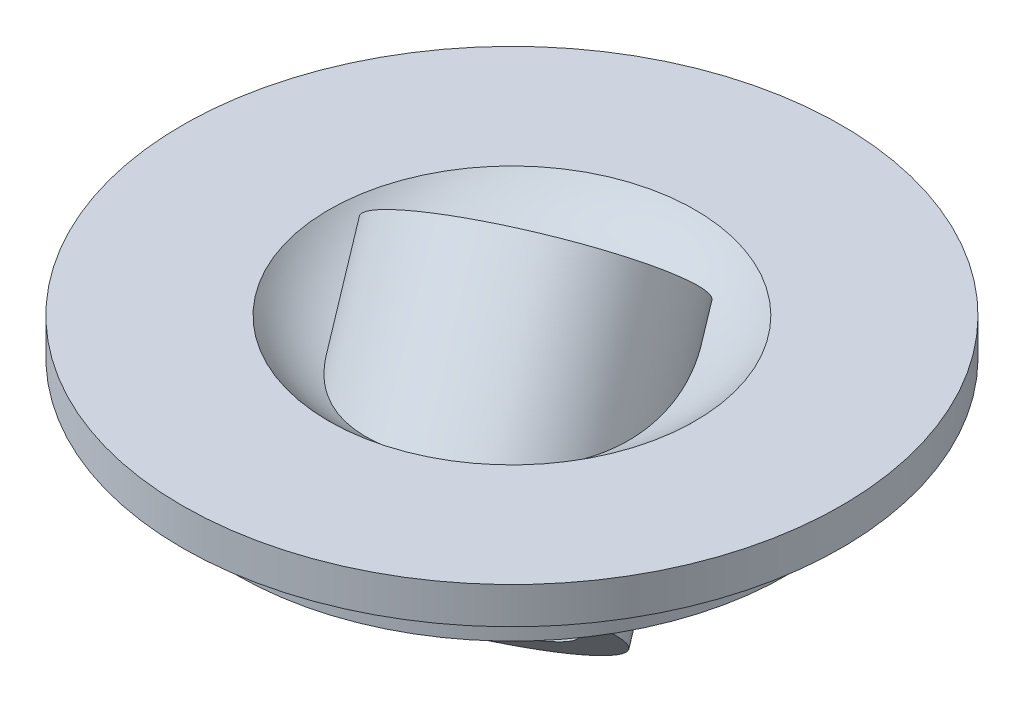
ISO-10303-21;
HEADER;
FILE_DESCRIPTION(('STEP AP214'),'2;1');
FILE_NAME('part.step','',(''),(''),'','','');
FILE_SCHEMA(('AUTOMOTIVE_DESIGN { 1 0 10303 214 1 1 1 1 }'));
ENDSEC;
DATA;
#1=APPLICATION_CONTEXT('core data for automotive mechanical design processes');
#2=APPLICATION_PROTOCOL_DEFINITION('international standard','automotive_design',2000,#1);
#3=PRODUCT_CONTEXT('',#1,'mechanical');
#4=PRODUCT('Part','Part','',(#3));
#5=PRODUCT_RELATED_PRODUCT_CATEGORY('part','',(#4));
#6=PRODUCT_DEFINITION_FORMATION('','',#4);
#7=PRODUCT_DEFINITION_CONTEXT('part definition',#1,'design');
#8=PRODUCT_DEFINITION('design','',#6,#7);
#9=PRODUCT_DEFINITION_SHAPE('','',#8);
#10=(LENGTH_UNIT() NAMED_UNIT(*) SI_UNIT(.MILLI.,.METRE.));
#11=(NAMED_UNIT(*) PLANE_ANGLE_UNIT() SI_UNIT($,.RADIAN.));
#12=(NAMED_UNIT(*) SI_UNIT($,.STERADIAN.) SOLID_ANGLE_UNIT());
#13=UNCERTAINTY_MEASURE_WITH_UNIT(LENGTH_MEASURE(1.E-05),#10,'distance_accuracy_value','');
#14=(GEOMETRIC_REPRESENTATION_CONTEXT(3) GLOBAL_UNCERTAINTY_ASSIGNED_CONTEXT((#13)) GLOBAL_UNIT_ASSIGNED_CONTEXT((#10,
#11,#12)) REPRESENTATION_CONTEXT('',''));
#15=CARTESIAN_POINT('',(0.,0.,0.));
#16=DIRECTION('',(0.,0.,1.));
#17=DIRECTION('',(1.,0.,0.));
#18=AXIS2_PLACEMENT_3D('',#15,#16,#17);
#19=CARTESIAN_POINT('',(-40.5,-20.5132034355964,30.5));
#20=DIRECTION('',(0.,1.,0.));
#21=DIRECTION('',(0.,0.,1.));
#22=AXIS2_PLACEMENT_3D('',#19,#20,#21);
#23=CYLINDRICAL_SURFACE('',#22,7.5);
#24=CARTESIAN_POINT('',(-40.5,0.699999999999999,30.5));
#25=DIRECTION('',(0.,1.,0.));
#26=DIRECTION('',(0.,0.,1.));
#27=AXIS2_PLACEMENT_3D('',#24,#25,#26);
#28=CIRCLE('',#27,7.5);
#29=CARTESIAN_POINT('',(-40.5,0.699999999999999,38.));
#30=VERTEX_POINT('',#29);
#31=EDGE_CURVE('E110',#30,#30,#28,.F.);
#32=ORIENTED_EDGE('',*,*,#31,.F.);
#33=EDGE_LOOP('',(#32));
#34=FACE_BOUND('',#33,.T.);
#35=CARTESIAN_POINT('',(-40.5,2.1,30.5));
#36=DIRECTION('',(0.,1.,0.));
#37=DIRECTION('',(0.,0.,1.));
#38=AXIS2_PLACEMENT_3D('',#35,#36,#37);
#39=CIRCLE('',#38,7.5);
#40=CARTESIAN_POINT('',(-40.5,2.1,38.));
#41=VERTEX_POINT('',#40);
#42=EDGE_CURVE('E109',#41,#41,#39,.T.);
#43=ORIENTED_EDGE('',*,*,#42,.F.);
#44=EDGE_LOOP('',(#43));
#45=FACE_BOUND('',#44,.T.);
#46=ADVANCED_FACE('F44',(#34,#45),#23,.T.);
#47=CARTESIAN_POINT('',(0.,0.7,0.));
#48=DIRECTION('',(0.,1.,0.));
#49=DIRECTION('',(1.,0.,0.));
#50=AXIS2_PLACEMENT_3D('',#47,#48,#49);
#51=PLANE('',#50);
#52=DIRECTION('',(-0.898112973405266,0.,0.439764808734341));
#53=VECTOR('',#52,1.);
#54=CARTESIAN_POINT('',(6.70774966718548,0.7,13.6989519825207));
#55=LINE('',#54,#53);
#56=CARTESIAN_POINT('',(-36.4173963108938,0.7,34.8153617597713));
#57=VERTEX_POINT('',#56);
#58=CARTESIAN_POINT('',(-39.5947315858972,0.7,36.3711573900235));
#59=VERTEX_POINT('',#58);
#60=EDGE_CURVE('E11',#57,#59,#55,.T.);
#61=ORIENTED_EDGE('',*,*,#60,.F.);
#62=CARTESIAN_POINT('',(-39.8843292677719,0.7,31.7573581627674));
#63=DIRECTION('',(0.,1.,0.));
#64=DIRECTION('',(0.439764808734341,0.,0.898112973405266));
#65=AXIS2_PLACEMENT_3D('',#62,#63,#64);
#66=ELLIPSE('',#65,4.94974746830581,3.5);
#67=EDGE_CURVE('E63',#59,#57,#66,.F.);
#68=ORIENTED_EDGE('',*,*,#67,.F.);
#69=EDGE_LOOP('',(#61,#68));
#70=FACE_BOUND('',#69,.T.);
#71=ORIENTED_EDGE('',*,*,#31,.T.);
#72=EDGE_LOOP('',(#71));
#73=FACE_BOUND('',#72,.T.);
#74=ADVANCED_FACE('F174',(#70,#73),#51,.F.);
#75=CARTESIAN_POINT('',(-40.5,2.1,30.5));
#76=DIRECTION('',(0.,1.,0.));
#77=DIRECTION('',(0.,0.,1.));
#78=AXIS2_PLACEMENT_3D('',#75,#76,#77);
#79=PLANE('',#78);
#80=CARTESIAN_POINT('',(-40.5,2.1,30.5));
#81=DIRECTION('',(0.,1.,0.));
#82=DIRECTION('',(0.,0.,1.));
#83=AXIS2_PLACEMENT_3D('',#80,#81,#82);
#84=CIRCLE('',#83,9.);
#85=CARTESIAN_POINT('',(-40.5,2.1,39.5));
#86=VERTEX_POINT('',#85);
#87=EDGE_CURVE('E117',#86,#86,#84,.T.);
#88=ORIENTED_EDGE('',*,*,#87,.F.);
#89=EDGE_LOOP('',(#88));
#90=FACE_BOUND('',#89,.T.);
#91=ORIENTED_EDGE('',*,*,#42,.T.);
#92=EDGE_LOOP('',(#91));
#93=FACE_BOUND('',#92,.T.);
#94=ADVANCED_FACE('F169',(#90,#93),#79,.F.);
#95=CARTESIAN_POINT('',(-40.5,3.1,30.5));
#96=DIRECTION('',(0.,1.,0.));
#97=DIRECTION('',(0.,0.,1.));
#98=AXIS2_PLACEMENT_3D('',#95,#96,#97);
#99=PLANE('',#98);
#100=CARTESIAN_POINT('',(-40.5,3.1,30.5));
#101=DIRECTION('',(0.,1.,0.));
#102=DIRECTION('',(0.,0.,1.));
#103=AXIS2_PLACEMENT_3D('',#100,#101,#102);
#104=CIRCLE('',#103,9.);
#105=CARTESIAN_POINT('',(-40.5,3.1,39.5));
#106=VERTEX_POINT('',#105);
#107=EDGE_CURVE('E113',#106,#106,#104,.T.);
#108=ORIENTED_EDGE('',*,*,#107,.T.);
#109=EDGE_LOOP('',(#108));
#110=FACE_BOUND('',#109,.T.);
#111=CARTESIAN_POINT('',(-40.5,3.1,30.5));
#112=DIRECTION('',(0.,1.,0.));
#113=DIRECTION('',(0.,0.,1.));
#114=AXIS2_PLACEMENT_3D('',#111,#112,#113);
#115=CIRCLE('',#114,5.);
#116=CARTESIAN_POINT('',(-40.5,3.1,35.5));
#117=VERTEX_POINT('',#116);
#118=EDGE_CURVE('E125',#117,#117,#115,.T.);
#119=ORIENTED_EDGE('',*,*,#118,.F.);
#120=EDGE_LOOP('',(#119));
#121=FACE_BOUND('',#120,.T.);
#122=ADVANCED_FACE('F159',(#110,#121),#99,.T.);
#123=CARTESIAN_POINT('',(-40.5,3.1,30.5));
#124=DIRECTION('',(0.,-1.,0.));
#125=DIRECTION('',(0.,0.,-1.));
#126=AXIS2_PLACEMENT_3D('',#123,#124,#125);
#127=CYLINDRICAL_SURFACE('',#126,9.);
#128=ORIENTED_EDGE('',*,*,#107,.F.);
#129=EDGE_LOOP('',(#128));
#130=FACE_BOUND('',#129,.T.);
#131=ORIENTED_EDGE('',*,*,#87,.T.);
#132=EDGE_LOOP('',(#131));
#133=FACE_BOUND('',#132,.T.);
#134=ADVANCED_FACE('F170',(#130,#133),#127,.T.);
#135=CARTESIAN_POINT('',(-40.5,5.1,30.5));
#136=DIRECTION('',(0.,-1.,0.));
#137=DIRECTION('',(0.,0.,-1.));
#138=AXIS2_PLACEMENT_3D('',#135,#136,#137);
#139=DEGENERATE_TOROIDAL_SURFACE('',#138,2.76393202250021,3.,.T.);
#140=ORIENTED_EDGE('',*,*,#118,.T.);
#141=EDGE_LOOP('',(#140));
#142=FACE_BOUND('',#141,.T.);
#143=CARTESIAN_POINT('',(-44.448601078953,2.38896345881085,29.605894368014));
#144=CARTESIAN_POINT('',(-44.396920791439,2.36994167752372,29.5594091770889));
#145=CARTESIAN_POINT('',(-44.3442015196923,2.35202594618844,29.5136467696762));
#146=CARTESIAN_POINT('',(-44.2368609787963,2.31836198322705,29.423604026956));
#147=CARTESIAN_POINT('',(-44.1822401486575,2.30261325541121,29.3793233541316));
#148=CARTESIAN_POINT('',(-44.0161064481141,2.25863201350778,29.2490045630518));
#149=CARTESIAN_POINT('',(-43.9019910177907,2.23354392684724,29.1651932394441));
#150=CARTESIAN_POINT('',(-43.667484927092,2.19097157925665,29.0029643461666));
#151=CARTESIAN_POINT('',(-43.5470559831892,2.17354168698973,28.9245885673583));
#152=CARTESIAN_POINT('',(-43.3020092879931,2.14543622367191,28.7733065122216));
#153=CARTESIAN_POINT('',(-43.1773895344203,2.13476393096336,28.7004029057246));
#154=CARTESIAN_POINT('',(-42.9136887349403,2.11793216964611,28.5525394443383));
#155=CARTESIAN_POINT('',(-42.7743366155507,2.11228169223805,28.4780135912216));
#156=CARTESIAN_POINT('',(-42.4937544911485,2.10483737500911,28.3323365267818));
#157=CARTESIAN_POINT('',(-42.3525237498455,2.10304509499937,28.261186691696));
#158=CARTESIAN_POINT('',(-42.0690292560724,2.10099497539635,28.1200897192807));
#159=CARTESIAN_POINT('',(-41.9267638142986,2.10074093404986,28.050145983918));
#160=CARTESIAN_POINT('',(-41.6420772086585,2.10063203063188,27.9106267276473));
#161=CARTESIAN_POINT('',(-41.4996560690071,2.10077711344583,27.8410511572292));
#162=CARTESIAN_POINT('',(-41.2144911423392,2.10226228275012,27.7030726024159));
#163=CARTESIAN_POINT('',(-41.0717480893089,2.10360069076146,27.6346681085249));
#164=CARTESIAN_POINT('',(-40.7848398124946,2.10966492367458,27.5009344534937));
#165=CARTESIAN_POINT('',(-40.6406744226908,2.11439114873945,27.4356056566211));
#166=CARTESIAN_POINT('',(-40.3508400963931,2.12967343678543,27.3107030526673));
#167=CARTESIAN_POINT('',(-40.2051800969289,2.14020476039637,27.251106075696));
#168=CARTESIAN_POINT('',(-39.911735610813,2.16911966305921,27.1396149174418));
#169=CARTESIAN_POINT('',(-39.76395249237,2.18749838660812,27.0877159997693));
#170=CARTESIAN_POINT('',(-39.4915189671237,2.22971060023012,27.0013187804902));
#171=CARTESIAN_POINT('',(-39.367114533458,2.25212606630535,26.9653620279905));
#172=CARTESIAN_POINT('',(-39.1176314958079,2.30397667337523,26.9009344392815));
#173=CARTESIAN_POINT('',(-38.9925522474228,2.33342047885088,26.8724729349675));
#174=CARTESIAN_POINT('',(-38.7435520766674,2.39938458342999,26.8239963967399));
#175=CARTESIAN_POINT('',(-38.6196290518684,2.43585553196174,26.8039253841829));
#176=CARTESIAN_POINT('',(-38.3731252371842,2.51605896627242,26.7725259172548));
#177=CARTESIAN_POINT('',(-38.2505432874539,2.55978454343618,26.7611892025928));
#178=CARTESIAN_POINT('',(-38.0729843934856,2.62896601825304,26.7512765540822));
#179=CARTESIAN_POINT('',(-38.0170822378407,2.65161026681834,26.7491169680645));
#180=CARTESIAN_POINT('',(-37.9057513575378,2.69846302862971,26.7467713372434));
#181=CARTESIAN_POINT('',(-37.8503239392276,2.72267486191056,26.7465896287771));
#182=CARTESIAN_POINT('',(-37.79524163458,2.74763769724285,26.7474131066537));
#183=B_SPLINE_CURVE_WITH_KNOTS('',3,(#143,#144,#145,#146,#147,#148,#149,#150,#151,#152,#153,
#154,#155,#156,#157,#158,#159,#160,#161,#162,#163,#164,#165,#166,#167,#168,#169,#170,#171,#172,
#173,#174,#175,#176,#177,#178,#179,#180,#181,#182),.UNSPECIFIED.,.F.,.F.,(4,2,2,2,2,2,2,2,2,2,2,
2,2,2,2,2,2,2,2,4),(0.,0.216156357494177,0.432263137919807,0.863099684150951,1.29694735076109,
1.73100533075689,2.20522974247453,2.679645840004,3.15523289822364,3.63075428653179,
4.10560788057352,4.58051757274534,5.05341883463436,5.52602791647742,5.91993510061711,
6.31433042140597,6.70605076802737,7.09740019652323,7.27841280039937,7.45982218008999),.UNSPECIFIED.);
#184=CARTESIAN_POINT('',(-44.413778725801,2.37636991684562,29.5748212310421));
#185=VERTEX_POINT('',#184);
#186=CARTESIAN_POINT('',(-43.1295718501551,2.13206798505995,28.6739869854774));
#187=VERTEX_POINT('',#186);
#188=EDGE_CURVE('E54',#185,#187,#183,.T.);
#189=ORIENTED_EDGE('',*,*,#188,.T.);
#190=CARTESIAN_POINT('',(-42.1294946723215,2.24271637961015,27.2024128686993));
#191=CARTESIAN_POINT('',(-42.0450748092779,2.24288878104044,27.1600953738742));
#192=CARTESIAN_POINT('',(-41.9563619612074,2.24115919001934,27.12631055858));
#193=CARTESIAN_POINT('',(-41.7741928651499,2.23446266268915,27.0761148949659));
#194=CARTESIAN_POINT('',(-41.6807255538589,2.22948782439313,27.0597467117597));
#195=CARTESIAN_POINT('',(-41.4707718639074,2.21626787730301,27.0404005820328));
#196=CARTESIAN_POINT('',(-41.3539810208777,2.20753158744471,27.0414155026029));
#197=CARTESIAN_POINT('',(-41.1220924995713,2.18951337538632,27.0618820531036));
#198=CARTESIAN_POINT('',(-41.0069989056617,2.18023034269993,27.0813725110277));
#199=CARTESIAN_POINT('',(-40.8079916808497,2.16474748793789,27.1284125346441));
#200=CARTESIAN_POINT('',(-40.7233219415836,2.15834801338839,27.1528355821914));
#201=CARTESIAN_POINT('',(-40.5563240953984,2.14641172947941,27.2088805319571));
#202=CARTESIAN_POINT('',(-40.4739970810612,2.14087531740794,27.2405057331097));
#203=CARTESIAN_POINT('',(-40.2308533125053,2.12586681530903,27.3448860772147));
#204=CARTESIAN_POINT('',(-40.0739283461536,2.11799997433014,27.4271319617074));
#205=CARTESIAN_POINT('',(-39.8235109632113,2.10858795119917,27.5807624256167));
#206=CARTESIAN_POINT('',(-39.7264611742408,2.10580585746649,27.6464692244926));
#207=CARTESIAN_POINT('',(-39.5382429586137,2.10189623029566,27.7859081254662));
#208=CARTESIAN_POINT('',(-39.4470762595922,2.10076918078486,27.8596425680434));
#209=CARTESIAN_POINT('',(-39.1831552311851,2.09932565058466,28.0915873422202));
#210=CARTESIAN_POINT('',(-39.0197359709904,2.10093935610934,28.2606915864882));
#211=CARTESIAN_POINT('',(-38.7948191886447,2.10431541803502,28.5323136145369));
#212=CARTESIAN_POINT('',(-38.7228404748968,2.10561089114551,28.6264779050442));
#213=CARTESIAN_POINT('',(-38.5861812562382,2.10802464477332,28.8199582655104));
#214=CARTESIAN_POINT('',(-38.5214982662553,2.10914298567828,28.919272564343));
#215=CARTESIAN_POINT('',(-38.3994617837358,2.110823218613,29.1225501017318));
#216=CARTESIAN_POINT('',(-38.3421224592522,2.11138404872339,29.2265218195428));
#217=CARTESIAN_POINT('',(-38.2350097634311,2.11175021186086,29.4382944606206));
#218=CARTESIAN_POINT('',(-38.185236760069,2.11155550815602,29.5460955698093));
#219=CARTESIAN_POINT('',(-38.0867314757221,2.11037817837486,29.7808196565747));
#220=CARTESIAN_POINT('',(-38.0391985764413,2.10928530272836,29.9082472168909));
#221=CARTESIAN_POINT('',(-37.9546613686703,2.10664669027217,30.1665977189242));
#222=CARTESIAN_POINT('',(-37.917660816224,2.10510079230361,30.297521889441));
#223=CARTESIAN_POINT('',(-37.8551221093604,2.10234173776601,30.5618542928802));
#224=CARTESIAN_POINT('',(-37.8295624780436,2.10112795942182,30.6952573776815));
#225=CARTESIAN_POINT('',(-37.7912002041167,2.09985136081899,30.9638171922188));
#226=CARTESIAN_POINT('',(-37.7783874322737,2.09978762599222,31.0989724429394));
#227=CARTESIAN_POINT('',(-37.7663331195781,2.10157872571784,31.3949807617622));
#228=CARTESIAN_POINT('',(-37.7700299025757,2.1037895235036,31.5559766275021));
#229=CARTESIAN_POINT('',(-37.8015899677934,2.11094091578354,31.8754583477888));
#230=CARTESIAN_POINT('',(-37.8294073425526,2.11587631820065,32.0339483884163));
#231=CARTESIAN_POINT('',(-37.9053678144726,2.12664179872137,32.3167813414967));
#232=CARTESIAN_POINT('',(-37.9491669883164,2.13216981828252,32.4422916902133));
#233=CARTESIAN_POINT('',(-38.0569583968096,2.14360224483467,32.6845612597129));
#234=CARTESIAN_POINT('',(-38.1209496413892,2.14950663335999,32.8013209092181));
#235=CARTESIAN_POINT('',(-38.2322631824004,2.15778216085569,32.9667172543278));
#236=CARTESIAN_POINT('',(-38.2721403041159,2.16045470068338,33.020448638966));
#237=CARTESIAN_POINT('',(-38.3568314786745,2.16544601993997,33.1238705092068));
#238=CARTESIAN_POINT('',(-38.4016429683499,2.16776498155681,33.173563069685));
#239=CARTESIAN_POINT('',(-38.495932965663,2.17191280600585,33.2682965994498));
#240=CARTESIAN_POINT('',(-38.5454096026113,2.17374186416522,33.3133394181982));
#241=CARTESIAN_POINT('',(-38.6486270696338,2.17680162968683,33.3982227415247));
#242=CARTESIAN_POINT('',(-38.7023672196934,2.17803243224635,33.4380640730498));
#243=CARTESIAN_POINT('',(-38.8540118021315,2.18045879841497,33.5388712197751));
#244=CARTESIAN_POINT('',(-38.955729663817,2.18098411244533,33.5942557524348));
#245=CARTESIAN_POINT('',(-39.1672568810115,2.17990247829238,33.6861227523084));
#246=CARTESIAN_POINT('',(-39.2770633751535,2.17829628074601,33.7226118674765));
#247=CARTESIAN_POINT('',(-39.4956059599726,2.17338287277576,33.7746567809742));
#248=CARTESIAN_POINT('',(-39.6041174722541,2.17016539896275,33.7911742407302));
#249=CARTESIAN_POINT('',(-39.8223084906924,2.16259864779303,33.8068485603968));
#250=CARTESIAN_POINT('',(-39.9319881304988,2.15824923956412,33.806003411993));
#251=CARTESIAN_POINT('',(-40.1565166662337,2.14879556857188,33.7874670964227));
#252=CARTESIAN_POINT('',(-40.2712782875296,2.1436615979006,33.7687628223052));
#253=CARTESIAN_POINT('',(-40.4968390325402,2.13363551658821,33.7149511104912));
#254=CARTESIAN_POINT('',(-40.6076365366155,2.12874350450011,33.679837048729));
#255=CARTESIAN_POINT('',(-40.873072242046,2.1178323655258,33.5760927038344));
#256=CARTESIAN_POINT('',(-41.0246178961175,2.1123191283877,33.4994793480624));
#257=CARTESIAN_POINT('',(-41.3136122673734,2.10430050082445,33.3228441721678));
#258=CARTESIAN_POINT('',(-41.4510237869272,2.10180287035833,33.2227627485071));
#259=CARTESIAN_POINT('',(-41.6741977131467,2.09990655703455,33.0359425175273));
#260=CARTESIAN_POINT('',(-41.76357675788,2.09983123352122,32.9534347288884));
#261=CARTESIAN_POINT('',(-41.9349150009346,2.10068108175215,32.7809853734957));
#262=CARTESIAN_POINT('',(-42.0168705937656,2.10160673686693,32.691040234639));
#263=CARTESIAN_POINT('',(-42.1735166671097,2.10388938085999,32.5049123185056));
#264=CARTESIAN_POINT('',(-42.2481996315745,2.10524680991245,32.4087232558271));
#265=CARTESIAN_POINT('',(-42.3902215957194,2.10780213867152,32.2110961180564));
#266=CARTESIAN_POINT('',(-42.4575615771687,2.10900005970936,32.1096587473523));
#267=CARTESIAN_POINT('',(-42.5869488462307,2.11081884180137,31.8985826445172));
#268=CARTESIAN_POINT('',(-42.6487315667886,2.11141824791864,31.7887814850445));
#269=CARTESIAN_POINT('',(-42.763883384945,2.11175219807433,31.5648462449454));
#270=CARTESIAN_POINT('',(-42.8172523716159,2.11148673071116,31.4507121072172));
#271=CARTESIAN_POINT('',(-42.9150483123503,2.1102049860406,31.2187028746911));
#272=CARTESIAN_POINT('',(-42.9594773935763,2.1091888876079,31.1008286775495));
#273=CARTESIAN_POINT('',(-43.0388521748177,2.10679444742238,30.8619271443302));
#274=CARTESIAN_POINT('',(-43.0737977961679,2.10541610266491,30.7408997821061));
#275=CARTESIAN_POINT('',(-43.1364917675145,2.10273742798515,30.4848573444666));
#276=CARTESIAN_POINT('',(-43.1632527793087,2.10145665987304,30.3495981069593));
#277=CARTESIAN_POINT('',(-43.2041368398718,2.09995079614895,30.0771792858848));
#278=CARTESIAN_POINT('',(-43.2182611671613,2.09972559372999,29.9400198959923));
#279=CARTESIAN_POINT('',(-43.2332620545838,2.10109596695478,29.6650850754565));
#280=CARTESIAN_POINT('',(-43.2341502402041,2.10268994346325,29.5273102917445));
#281=CARTESIAN_POINT('',(-43.222037671017,2.10828528133563,29.252495785267));
#282=CARTESIAN_POINT('',(-43.2090466543608,2.11228495391608,29.1154556148314));
#283=CARTESIAN_POINT('',(-43.1652082035557,2.12381541978053,28.8229790658263));
#284=CARTESIAN_POINT('',(-43.1319487439922,2.13179020105246,28.6679092880411));
#285=CARTESIAN_POINT('',(-43.0437196653147,2.15107003928072,28.3642992379604));
#286=CARTESIAN_POINT('',(-42.9887873350837,2.16236936779935,28.2157482351636));
#287=CARTESIAN_POINT('',(-42.8749266633015,2.18267031860069,27.9757470587805));
#288=CARTESIAN_POINT('',(-42.8227408581568,2.19127040157321,27.8810814835905));
#289=CARTESIAN_POINT('',(-42.7048046467546,2.20792454569179,27.7004532175448));
#290=CARTESIAN_POINT('',(-42.6390713441154,2.21597927846756,27.6144797549989));
#291=CARTESIAN_POINT('',(-42.5035218816463,2.22867446154817,27.4676154198265));
#292=CARTESIAN_POINT('',(-42.4357497342371,2.23364379161043,27.4048954854873));
#293=CARTESIAN_POINT('',(-42.2898238653722,2.24057737942565,27.2929117807359));
#294=CARTESIAN_POINT('',(-42.2116943430409,2.24254851223521,27.2436174385112));
#295=CARTESIAN_POINT('',(-42.1294946723215,2.24271637961015,27.2024128686993));
#296=B_SPLINE_CURVE_WITH_KNOTS('',3,(#190,#191,#192,#193,#194,#195,#196,#197,#198,#199,#200,
#201,#202,#203,#204,#205,#206,#207,#208,#209,#210,#211,#212,#213,#214,#215,#216,#217,#218,#219,
#220,#221,#222,#223,#224,#225,#226,#227,#228,#229,#230,#231,#232,#233,#234,#235,#236,#237,#238,
#239,#240,#241,#242,#243,#244,#245,#246,#247,#248,#249,#250,#251,#252,#253,#254,#255,#256,#257,
#258,#259,#260,#261,#262,#263,#264,#265,#266,#267,#268,#269,#270,#271,#272,#273,#274,#275,#276,
#277,#278,#279,#280,#281,#282,#283,#284,#285,#286,#287,#288,#289,#290,#291,#292,#293,#294,#295),
.UNSPECIFIED.,.T.,.F.,(4,2,2,2,2,2,2,2,2,2,2,2,2,2,2,2,2,2,2,2,2,2,2,2,2,2,2,2,2,2,2,2,2,2,2,2,
2,2,2,2,2,2,2,2,2,2,2,2,2,2,2,2,4),(0.,0.282862718804584,0.566416775656095,0.915827394025472,
1.26597396186361,1.53069050762265,1.79552855109381,2.3253720914989,2.67668858535929,
3.02810778211257,3.7300931884179,4.08543979252111,4.44066499044714,4.79656551493004,
5.15248334251107,5.56005522534918,5.96777227482904,6.37472071463201,6.78134551582021,
7.26295440969926,7.74364868949912,8.14126268377493,8.53885718503305,8.73949897298789,
8.94003702447849,9.14049500093451,9.34092106910966,9.68640922169949,10.0317757388433,
10.3597495838684,10.6877613654927,11.0355594088775,11.3834979677756,11.8903704899594,
12.3985445691172,12.7630044973606,13.1276405011846,13.4926494329407,13.8576095023986,
14.2352273568342,14.61285018941,14.9903830638268,15.3679190697739,15.7809987024934,
16.1940365370152,16.6067115732618,17.019097251795,17.4941060899821,17.9683011991952,
18.2927183543421,18.6167284168878,18.8927859909093,19.1682095879901),.UNSPECIFIED.);
#297=CARTESIAN_POINT('',(-40.3299088342624,2.13206798505903,27.3031201712245));
#298=VERTEX_POINT('',#297);
#299=EDGE_CURVE('E66',#187,#298,#296,.T.);
#300=ORIENTED_EDGE('',*,*,#299,.T.);
#301=CARTESIAN_POINT('',(-38.830831174022,2.37636991684561,26.841107394382));
#302=VERTEX_POINT('',#301);
#303=EDGE_CURVE('E93',#298,#302,#183,.T.);
#304=ORIENTED_EDGE('',*,*,#303,.T.);
#305=CARTESIAN_POINT('',(-44.448601078953,2.41922153901158,29.357496661318));
#306=CARTESIAN_POINT('',(-44.4350365527932,2.40033708988653,29.4459566259214));
#307=CARTESIAN_POINT('',(-44.4207472771893,2.38324386802799,29.5346754945353));
#308=CARTESIAN_POINT('',(-44.3903230529493,2.35214233165212,29.7123268727833));
#309=CARTESIAN_POINT('',(-44.3741883393886,2.33813362488675,29.8012593537973));
#310=CARTESIAN_POINT('',(-44.339672453822,2.31269801640096,29.9790634660617));
#311=CARTESIAN_POINT('',(-44.3212911046276,2.30127131852206,30.0679350919558));
#312=CARTESIAN_POINT('',(-44.2820200847672,2.28062325445762,30.2453776329241));
#313=CARTESIAN_POINT('',(-44.2611303393523,2.27140195401619,30.333948538956));
#314=CARTESIAN_POINT('',(-44.1940600192733,2.2464309127005,30.6001496477774));
#315=CARTESIAN_POINT('',(-44.1437116129622,2.23354143719923,30.7770266559133));
#316=CARTESIAN_POINT('',(-44.0309298960706,2.21337379609503,31.1271769580223));
#317=CARTESIAN_POINT('',(-43.9684982386815,2.20609486355376,31.3004507413895));
#318=CARTESIAN_POINT('',(-43.8350514970426,2.19618629754349,31.6320697766573));
#319=CARTESIAN_POINT('',(-43.7647524205082,2.19330953770312,31.7906952872393));
#320=CARTESIAN_POINT('',(-43.6127118248152,2.19085725021439,32.1024403767373));
#321=CARTESIAN_POINT('',(-43.5309685999857,2.19128221518066,32.2555591306258));
#322=CARTESIAN_POINT('',(-43.3560570011919,2.19527909150082,32.554569256937));
#323=CARTESIAN_POINT('',(-43.2629189196416,2.19884280876864,32.7004784041589));
#324=CARTESIAN_POINT('',(-43.0647639954119,2.20922406461776,32.9839566620659));
#325=CARTESIAN_POINT('',(-42.9597462818661,2.21604184186426,33.1215251601816));
#326=CARTESIAN_POINT('',(-42.7681580209226,2.23074379855605,33.3498677053897));
#327=CARTESIAN_POINT('',(-42.6844559258212,2.23781918934491,33.4431070065426));
#328=CARTESIAN_POINT('',(-42.510658500322,2.25376422666793,33.6231850506805));
#329=CARTESIAN_POINT('',(-42.4205668603959,2.26263284286327,33.7100274302482));
#330=CARTESIAN_POINT('',(-42.2340233036097,2.28207773530518,33.876267529696));
#331=CARTESIAN_POINT('',(-42.1375765966065,2.29265262281338,33.9556712215646));
#332=CARTESIAN_POINT('',(-41.9384665798076,2.31529910198453,34.1059365013066));
#333=CARTESIAN_POINT('',(-41.8358044393862,2.32737041255475,34.1767996885374));
#334=CARTESIAN_POINT('',(-41.5581934935567,2.36063694612118,34.3501792192792));
#335=CARTESIAN_POINT('',(-41.3782081195182,2.38281497923107,34.4447570370373));
#336=CARTESIAN_POINT('',(-41.0985773551764,2.41675159439194,34.5632289986173));
#337=CARTESIAN_POINT('',(-41.0037099351673,2.42818110267904,34.5988321142734));
#338=CARTESIAN_POINT('',(-40.8112384088882,2.45091586922162,34.6616520684025));
#339=CARTESIAN_POINT('',(-40.7136356998221,2.46222118694966,34.6888731062825));
#340=CARTESIAN_POINT('',(-40.5155326213047,2.48443142756551,34.7345534062562));
#341=CARTESIAN_POINT('',(-40.4150154984875,2.49533250168262,34.7529420677598));
#342=CARTESIAN_POINT('',(-40.2126419641878,2.51624793178188,34.7801562529151));
#343=CARTESIAN_POINT('',(-40.1107862308694,2.52626271828488,34.7889864433398));
#344=CARTESIAN_POINT('',(-39.9065968340233,2.54503443631571,34.7967368159793));
#345=CARTESIAN_POINT('',(-39.8042632749177,2.55379163050387,34.7956590706286));
#346=CARTESIAN_POINT('',(-39.6000828043949,2.56970710836319,34.7833770295496));
#347=CARTESIAN_POINT('',(-39.4982358221906,2.57686563199764,34.7721742548821));
#348=CARTESIAN_POINT('',(-39.3089326729865,2.58850540395978,34.7416583064692));
#349=CARTESIAN_POINT('',(-39.2212932589375,2.5932113330642,34.723557460378));
#350=CARTESIAN_POINT('',(-39.0478579023497,2.60104066955461,34.679653296086));
#351=CARTESIAN_POINT('',(-38.9620625651901,2.60416356463205,34.6538474886589));
#352=CARTESIAN_POINT('',(-38.7931300570157,2.60872127526579,34.5947125857758));
#353=CARTESIAN_POINT('',(-38.709990782367,2.61015746066732,34.5613896215654));
#354=CARTESIAN_POINT('',(-38.5469886573734,2.61130396439929,34.4874702870335));
#355=CARTESIAN_POINT('',(-38.4671269870583,2.61101366654137,34.4468713248954));
#356=CARTESIAN_POINT('',(-38.2442761128724,2.60770782359791,34.3207423263541));
#357=CARTESIAN_POINT('',(-38.1060660681273,2.60256317584529,34.2265996139178));
#358=CARTESIAN_POINT('',(-37.8472418476857,2.58683772866474,34.0171912533324));
#359=CARTESIAN_POINT('',(-37.7266258516096,2.57625749214648,33.9019277932433));
#360=CARTESIAN_POINT('',(-37.5047901214381,2.55070100264355,33.6528541443868));
#361=CARTESIAN_POINT('',(-37.4037304638894,2.5356908167807,33.5189051654126));
#362=CARTESIAN_POINT('',(-37.2238924341904,2.50285486307618,33.2371699543122));
#363=CARTESIAN_POINT('',(-37.1451191089583,2.48502845890143,33.0893805979913));
#364=CARTESIAN_POINT('',(-37.0053522969672,2.44689156426245,32.7725911913691));
#365=CARTESIAN_POINT('',(-36.946115569389,2.42649492144056,32.6028310779296));
#366=CARTESIAN_POINT('',(-36.8532364815908,2.38638694705857,32.2563941022634));
#367=CARTESIAN_POINT('',(-36.8196043902598,2.36667589347924,32.0797144947699));
#368=CARTESIAN_POINT('',(-36.7825625211949,2.33495484483607,31.7755377544255));
#369=CARTESIAN_POINT('',(-36.7731901278232,2.3223787028895,31.6487709183772));
#370=CARTESIAN_POINT('',(-36.7655723430533,2.29872671738377,31.3947257960304));
#371=CARTESIAN_POINT('',(-36.7673305364787,2.28765135835434,31.2674473581518));
#372=CARTESIAN_POINT('',(-36.7811391504873,2.26723285655062,31.0130972935524));
#373=CARTESIAN_POINT('',(-36.7932086967568,2.25789297198494,30.8860264910542));
#374=CARTESIAN_POINT('',(-36.8267990160405,2.24107525255224,30.6330052674162));
#375=CARTESIAN_POINT('',(-36.8483223504284,2.23359792317988,30.5070551593551));
#376=CARTESIAN_POINT('',(-36.9091937440997,2.21818839757875,30.2123807069968));
#377=CARTESIAN_POINT('',(-36.9521578528123,2.21103849038412,30.0443581800068));
#378=CARTESIAN_POINT('',(-37.0521895800439,2.20002137411038,29.7124449882818));
#379=CARTESIAN_POINT('',(-37.1092625161901,2.19615540519275,29.5485559071706));
#380=CARTESIAN_POINT('',(-37.2361189184434,2.19157587082316,29.2256024770702));
#381=CARTESIAN_POINT('',(-37.3059122017561,2.19086475101215,29.0665419660158));
#382=CARTESIAN_POINT('',(-37.4569827825114,2.19272073420759,28.7540422301607));
#383=CARTESIAN_POINT('',(-37.5382582980086,2.19528732903642,28.6006021377626));
#384=CARTESIAN_POINT('',(-37.7133825309344,2.20432569727849,28.2960883036087));
#385=CARTESIAN_POINT('',(-37.8074940706092,2.21089318087081,28.1451687841295));
#386=CARTESIAN_POINT('',(-38.0054390128441,2.2290943888187,27.8501307733709));
#387=CARTESIAN_POINT('',(-38.1092743225608,2.24072910866931,27.7060136246356));
#388=CARTESIAN_POINT('',(-38.3248310900963,2.27071065423741,27.4250875623293));
#389=CARTESIAN_POINT('',(-38.4365335719098,2.2890417472155,27.2882623731841));
#390=CARTESIAN_POINT('',(-38.6658648642091,2.33479785973457,27.0213429720897));
#391=CARTESIAN_POINT('',(-38.7834900587613,2.36221738635326,26.8912447492257));
#392=CARTESIAN_POINT('',(-38.939948482245,2.40662404475043,26.7238356309791));
#393=CARTESIAN_POINT('',(-38.97765130918,2.41792103300048,26.6839176093652));
#394=CARTESIAN_POINT('',(-39.0531364235965,2.44193891766648,26.604610760717));
#395=CARTESIAN_POINT('',(-39.0909186866795,2.45465942600654,26.5652217927174));
#396=CARTESIAN_POINT('',(-39.1286652370279,2.46817501918292,26.5260617132925));
#397=B_SPLINE_CURVE_WITH_KNOTS('',3,(#305,#306,#307,#308,#309,#310,#311,#312,#313,#314,#315,
#316,#317,#318,#319,#320,#321,#322,#323,#324,#325,#326,#327,#328,#329,#330,#331,#332,#333,#334,
#335,#336,#337,#338,#339,#340,#341,#342,#343,#344,#345,#346,#347,#348,#349,#350,#351,#352,#353,
#354,#355,#356,#357,#358,#359,#360,#361,#362,#363,#364,#365,#366,#367,#368,#369,#370,#371,#372,
#373,#374,#375,#376,#377,#378,#379,#380,#381,#382,#383,#384,#385,#386,#387,#388,#389,#390,#391,
#392,#393,#394,#395,#396),.UNSPECIFIED.,.F.,.F.,(4,2,2,2,2,2,2,2,2,2,2,2,2,2,2,2,2,2,2,2,2,2,2,
2,2,2,2,2,2,2,2,2,2,2,2,2,2,2,2,2,2,2,2,2,2,4),(0.,0.274356430363723,0.548677951511384,
0.823021121923643,1.0973724696361,1.64988902945794,2.20233004911714,2.72244560235642,
3.2426387578996,3.76147789935272,4.28035510030024,4.65654821969708,5.03252579979867,
5.40819890027567,5.78380153978032,6.39442489676824,6.7000333148863,7.00548837364358,
7.31334601520317,7.62105328222778,7.92869618784974,8.23629288464358,8.50477939733994,
8.77335274345852,9.04170781912123,9.31015867746453,9.80948865243136,10.3087669271976,
10.8119735227991,11.3152939825135,11.8560256578927,12.3969740827947,12.7796938356205,
13.1625368571171,13.5460915284107,13.9297501827208,14.4497211341409,14.9698883625847,
15.4904587546018,16.010948447064,16.5444069514028,17.0779703048138,17.6102880608604,
18.1422846763542,18.3104445023363,18.4785585962468),.UNSPECIFIED.);
#398=EDGE_CURVE('E96',#185,#302,#397,.T.);
#399=ORIENTED_EDGE('',*,*,#398,.F.);
#400=EDGE_LOOP('',(#189,#300,#304,#399));
#401=FACE_BOUND('',#400,.T.);
#402=ADVANCED_FACE('F50',(#142,#401),#139,.F.);
#403=CARTESIAN_POINT('',(-41.1219213567665,3.51421356237311,29.2298764524671));
#404=DIRECTION('',(0.310960678383256,-0.707106781186551,0.635061773766474));
#405=DIRECTION('',(0.,-0.668188714140625,-0.74399182945453));
#406=AXIS2_PLACEMENT_3D('',#403,#404,#405);
#407=CYLINDRICAL_SURFACE('',#406,3.5);
#408=CARTESIAN_POINT('',(-41.1219213567665,3.51421356237311,29.2298764524671));
#409=DIRECTION('',(-0.310960678383256,0.707106781186552,-0.635061773766474));
#410=DIRECTION('',(0.,0.668188714140624,0.74399182945453));
#411=AXIS2_PLACEMENT_3D('',#408,#409,#410);
#412=CIRCLE('',#411,3.5);
#413=EDGE_CURVE('E133',#185,#302,#412,.T.);
#414=ORIENTED_EDGE('',*,*,#413,.F.);
#415=ORIENTED_EDGE('',*,*,#398,.T.);
#416=EDGE_LOOP('',(#414,#415));
#417=FACE_BOUND('',#416,.T.);
#418=ADVANCED_FACE('F155',(#417),#407,.T.);
#419=CARTESIAN_POINT('',(-41.1219213567665,3.51421356237311,29.2298764524671));
#420=DIRECTION('',(-0.310960678383256,0.707106781186552,-0.635061773766474));
#421=DIRECTION('',(0.,0.668188714140624,0.74399182945453));
#422=AXIS2_PLACEMENT_3D('',#419,#420,#421);
#423=PLANE('',#422);
#424=ORIENTED_EDGE('',*,*,#188,.F.);
#425=ORIENTED_EDGE('',*,*,#413,.T.);
#426=ORIENTED_EDGE('',*,*,#303,.F.);
#427=CARTESIAN_POINT('',(-41.1219213567665,3.51421356237311,29.2298764524671));
#428=DIRECTION('',(-0.310960678383256,0.707106781186552,-0.635061773766474));
#429=DIRECTION('',(0.,0.668188714140624,0.74399182945453));
#430=AXIS2_PLACEMENT_3D('',#427,#428,#429);
#431=CIRCLE('',#430,2.5);
#432=EDGE_CURVE('E85',#187,#298,#431,.T.);
#433=ORIENTED_EDGE('',*,*,#432,.F.);
#434=EDGE_LOOP('',(#424,#425,#426,#433));
#435=FACE_BOUND('',#434,.T.);
#436=ADVANCED_FACE('F86',(#435),#423,.T.);
#437=CARTESIAN_POINT('',(-38.9451966080837,-1.43553390593275,33.6753088688324));
#438=DIRECTION('',(-0.310960678383256,0.707106781186552,-0.635061773766474));
#439=DIRECTION('',(0.,0.668188714140624,0.74399182945453));
#440=AXIS2_PLACEMENT_3D('',#437,#438,#439);
#441=PLANE('',#440);
#442=CARTESIAN_POINT('',(-38.9451966080837,-1.43553390593275,33.6753088688324));
#443=DIRECTION('',(-0.310960678383256,0.707106781186552,-0.635061773766474));
#444=DIRECTION('',(0.,0.668188714140624,0.74399182945453));
#445=AXIS2_PLACEMENT_3D('',#442,#443,#444);
#446=CIRCLE('',#445,2.5);
#447=CARTESIAN_POINT('',(-38.9451966080837,0.234937879418809,35.5352884424687));
#448=VERTEX_POINT('',#447);
#449=EDGE_CURVE('E82',#448,#448,#446,.T.);
#450=ORIENTED_EDGE('',*,*,#449,.T.);
#451=EDGE_LOOP('',(#450));
#452=FACE_BOUND('',#451,.T.);
#453=CARTESIAN_POINT('',(-38.9451966080837,-1.43553390593275,33.6753088688324));
#454=DIRECTION('',(-0.310960678383256,0.707106781186552,-0.635061773766474));
#455=DIRECTION('',(0.,0.668188714140624,0.74399182945453));
#456=AXIS2_PLACEMENT_3D('',#453,#454,#455);
#457=CIRCLE('',#456,3.5);
#458=EDGE_CURVE('E91',#57,#59,#457,.T.);
#459=ORIENTED_EDGE('',*,*,#458,.F.);
#460=ORIENTED_EDGE('',*,*,#60,.T.);
#461=EDGE_LOOP('',(#459,#460));
#462=FACE_BOUND('',#461,.T.);
#463=ADVANCED_FACE('F151',(#452,#462),#441,.F.);
#464=ORIENTED_EDGE('',*,*,#458,.T.);
#465=ORIENTED_EDGE('',*,*,#67,.T.);
#466=EDGE_LOOP('',(#464,#465));
#467=FACE_BOUND('',#466,.T.);
#468=ADVANCED_FACE('F148',(#467),#407,.T.);
#469=CARTESIAN_POINT('',(-41.1219213567665,3.51421356237311,29.2298764524671));
#470=DIRECTION('',(0.310960678383256,-0.707106781186551,0.635061773766474));
#471=DIRECTION('',(0.,-0.668188714140625,-0.74399182945453));
#472=AXIS2_PLACEMENT_3D('',#469,#470,#471);
#473=CYLINDRICAL_SURFACE('',#472,2.5);
#474=ORIENTED_EDGE('',*,*,#449,.F.);
#475=EDGE_LOOP('',(#474));
#476=FACE_BOUND('',#475,.T.);
#477=ORIENTED_EDGE('',*,*,#432,.T.);
#478=ORIENTED_EDGE('',*,*,#299,.F.);
#479=EDGE_LOOP('',(#477,#478));
#480=FACE_BOUND('',#479,.T.);
#481=ADVANCED_FACE('F83',(#476,#480),#473,.F.);
#482=CLOSED_SHELL('',(#46,#74,#94,#122,#134,#402,#418,#436,#463,#468,#481));
#483=MANIFOLD_SOLID_BREP('B2',#482);
#484=ADVANCED_BREP_SHAPE_REPRESENTATION('',(#18,#483),#14);
#485=SHAPE_DEFINITION_REPRESENTATION(#9,#484);
ENDSEC;
END-ISO-10303-21;
